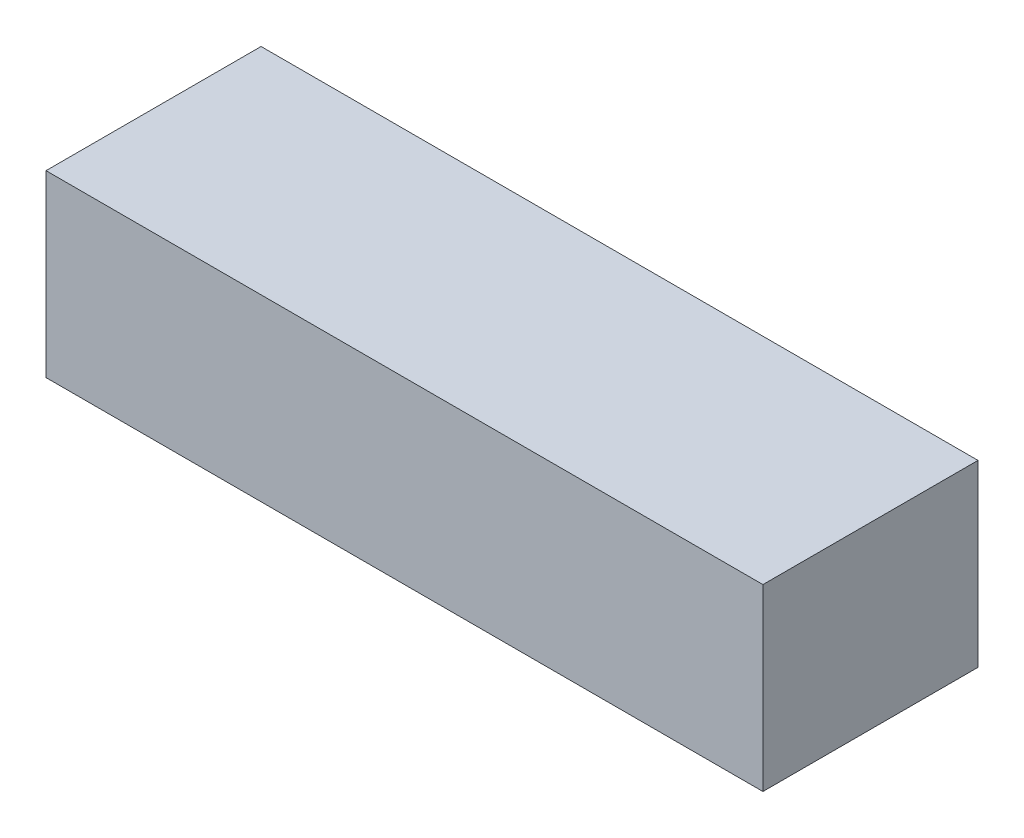
ISO-10303-21;
HEADER;
FILE_DESCRIPTION(('STEP AP214'),'2;1');
FILE_NAME('part.step','',(''),(''),'','','');
FILE_SCHEMA(('AUTOMOTIVE_DESIGN { 1 0 10303 214 1 1 1 1 }'));
ENDSEC;
DATA;
#1=APPLICATION_CONTEXT('core data for automotive mechanical design processes');
#2=APPLICATION_PROTOCOL_DEFINITION('international standard','automotive_design',2000,#1);
#3=PRODUCT_CONTEXT('',#1,'mechanical');
#4=PRODUCT('Part','Part','',(#3));
#5=PRODUCT_RELATED_PRODUCT_CATEGORY('part','',(#4));
#6=PRODUCT_DEFINITION_FORMATION('','',#4);
#7=PRODUCT_DEFINITION_CONTEXT('part definition',#1,'design');
#8=PRODUCT_DEFINITION('design','',#6,#7);
#9=PRODUCT_DEFINITION_SHAPE('','',#8);
#10=(LENGTH_UNIT() NAMED_UNIT(*) SI_UNIT(.MILLI.,.METRE.));
#11=(NAMED_UNIT(*) PLANE_ANGLE_UNIT() SI_UNIT($,.RADIAN.));
#12=(NAMED_UNIT(*) SI_UNIT($,.STERADIAN.) SOLID_ANGLE_UNIT());
#13=UNCERTAINTY_MEASURE_WITH_UNIT(LENGTH_MEASURE(1.E-05),#10,'distance_accuracy_value','');
#14=(GEOMETRIC_REPRESENTATION_CONTEXT(3) GLOBAL_UNCERTAINTY_ASSIGNED_CONTEXT((#13)) GLOBAL_UNIT_ASSIGNED_CONTEXT((#10,
#11,#12)) REPRESENTATION_CONTEXT('',''));
#15=CARTESIAN_POINT('',(0.,0.,0.));
#16=DIRECTION('',(0.,0.,1.));
#17=DIRECTION('',(1.,0.,0.));
#18=AXIS2_PLACEMENT_3D('',#15,#16,#17);
#19=CARTESIAN_POINT('',(7.77445109122676,5.,-6.));
#20=DIRECTION('',(1.,0.,0.));
#21=DIRECTION('',(0.,0.,-1.));
#22=AXIS2_PLACEMENT_3D('',#19,#20,#21);
#23=PLANE('',#22);
#24=DIRECTION('',(0.,0.,1.));
#25=VECTOR('',#24,1.);
#26=CARTESIAN_POINT('',(7.77445109122676,0.,-6.));
#27=LINE('',#26,#25);
#28=CARTESIAN_POINT('',(7.77445109122676,0.,-6.));
#29=VERTEX_POINT('',#28);
#30=CARTESIAN_POINT('',(7.77445109122676,0.,0.));
#31=VERTEX_POINT('',#30);
#32=EDGE_CURVE('E98',#29,#31,#27,.T.);
#33=ORIENTED_EDGE('',*,*,#32,.T.);
#34=DIRECTION('',(0.,-1.,0.));
#35=VECTOR('',#34,1.);
#36=CARTESIAN_POINT('',(7.77445109122676,5.,0.));
#37=LINE('',#36,#35);
#38=CARTESIAN_POINT('',(7.77445109122676,5.,0.));
#39=VERTEX_POINT('',#38);
#40=EDGE_CURVE('E11',#39,#31,#37,.T.);
#41=ORIENTED_EDGE('',*,*,#40,.F.);
#42=DIRECTION('',(0.,0.,1.));
#43=VECTOR('',#42,1.);
#44=CARTESIAN_POINT('',(7.77445109122676,5.,-6.));
#45=LINE('',#44,#43);
#46=CARTESIAN_POINT('',(7.77445109122676,5.,-6.));
#47=VERTEX_POINT('',#46);
#48=EDGE_CURVE('E86',#47,#39,#45,.T.);
#49=ORIENTED_EDGE('',*,*,#48,.F.);
#50=DIRECTION('',(0.,-1.,0.));
#51=VECTOR('',#50,1.);
#52=CARTESIAN_POINT('',(7.77445109122676,5.,-6.));
#53=LINE('',#52,#51);
#54=EDGE_CURVE('E94',#47,#29,#53,.T.);
#55=ORIENTED_EDGE('',*,*,#54,.T.);
#56=EDGE_LOOP('',(#33,#41,#49,#55));
#57=FACE_BOUND('',#56,.T.);
#58=ADVANCED_FACE('F35',(#57),#23,.F.);
#59=CARTESIAN_POINT('',(7.77445109122676,5.,0.));
#60=DIRECTION('',(0.,0.,-1.));
#61=DIRECTION('',(-1.,0.,0.));
#62=AXIS2_PLACEMENT_3D('',#59,#60,#61);
#63=PLANE('',#62);
#64=DIRECTION('',(1.,0.,0.));
#65=VECTOR('',#64,1.);
#66=CARTESIAN_POINT('',(7.77445109122676,0.,0.));
#67=LINE('',#66,#65);
#68=CARTESIAN_POINT('',(27.7744510912268,0.,0.));
#69=VERTEX_POINT('',#68);
#70=EDGE_CURVE('E90',#31,#69,#67,.T.);
#71=ORIENTED_EDGE('',*,*,#70,.T.);
#72=DIRECTION('',(0.,-1.,0.));
#73=VECTOR('',#72,1.);
#74=CARTESIAN_POINT('',(27.7744510912268,5.,0.));
#75=LINE('',#74,#73);
#76=CARTESIAN_POINT('',(27.7744510912268,5.,0.));
#77=VERTEX_POINT('',#76);
#78=EDGE_CURVE('E43',#77,#69,#75,.T.);
#79=ORIENTED_EDGE('',*,*,#78,.F.);
#80=DIRECTION('',(1.,0.,0.));
#81=VECTOR('',#80,1.);
#82=CARTESIAN_POINT('',(7.77445109122676,5.,0.));
#83=LINE('',#82,#81);
#84=EDGE_CURVE('E81',#39,#77,#83,.T.);
#85=ORIENTED_EDGE('',*,*,#84,.F.);
#86=ORIENTED_EDGE('',*,*,#40,.T.);
#87=EDGE_LOOP('',(#71,#79,#85,#86));
#88=FACE_BOUND('',#87,.T.);
#89=ADVANCED_FACE('F89',(#88),#63,.F.);
#90=CARTESIAN_POINT('',(27.7744510912268,5.,0.));
#91=DIRECTION('',(-1.,0.,0.));
#92=DIRECTION('',(0.,0.,1.));
#93=AXIS2_PLACEMENT_3D('',#90,#91,#92);
#94=PLANE('',#93);
#95=DIRECTION('',(0.,0.,-1.));
#96=VECTOR('',#95,1.);
#97=CARTESIAN_POINT('',(27.7744510912268,0.,0.));
#98=LINE('',#97,#96);
#99=CARTESIAN_POINT('',(27.7744510912268,0.,-6.));
#100=VERTEX_POINT('',#99);
#101=EDGE_CURVE('E68',#69,#100,#98,.T.);
#102=ORIENTED_EDGE('',*,*,#101,.T.);
#103=DIRECTION('',(0.,-1.,0.));
#104=VECTOR('',#103,1.);
#105=CARTESIAN_POINT('',(27.7744510912268,5.,-6.));
#106=LINE('',#105,#104);
#107=CARTESIAN_POINT('',(27.7744510912268,5.,-6.));
#108=VERTEX_POINT('',#107);
#109=EDGE_CURVE('E91',#108,#100,#106,.T.);
#110=ORIENTED_EDGE('',*,*,#109,.F.);
#111=DIRECTION('',(0.,0.,-1.));
#112=VECTOR('',#111,1.);
#113=CARTESIAN_POINT('',(27.7744510912268,5.,0.));
#114=LINE('',#113,#112);
#115=EDGE_CURVE('E84',#77,#108,#114,.T.);
#116=ORIENTED_EDGE('',*,*,#115,.F.);
#117=ORIENTED_EDGE('',*,*,#78,.T.);
#118=EDGE_LOOP('',(#102,#110,#116,#117));
#119=FACE_BOUND('',#118,.T.);
#120=ADVANCED_FACE('F92',(#119),#94,.F.);
#121=CARTESIAN_POINT('',(27.7744510912268,5.,-6.));
#122=DIRECTION('',(0.,0.,1.));
#123=DIRECTION('',(1.,0.,0.));
#124=AXIS2_PLACEMENT_3D('',#121,#122,#123);
#125=PLANE('',#124);
#126=DIRECTION('',(-1.,0.,0.));
#127=VECTOR('',#126,1.);
#128=CARTESIAN_POINT('',(27.7744510912268,0.,-6.));
#129=LINE('',#128,#127);
#130=EDGE_CURVE('E74',#100,#29,#129,.T.);
#131=ORIENTED_EDGE('',*,*,#130,.T.);
#132=ORIENTED_EDGE('',*,*,#54,.F.);
#133=DIRECTION('',(-1.,0.,0.));
#134=VECTOR('',#133,1.);
#135=CARTESIAN_POINT('',(27.7744510912268,5.,-6.));
#136=LINE('',#135,#134);
#137=EDGE_CURVE('E51',#108,#47,#136,.T.);
#138=ORIENTED_EDGE('',*,*,#137,.F.);
#139=ORIENTED_EDGE('',*,*,#109,.T.);
#140=EDGE_LOOP('',(#131,#132,#138,#139));
#141=FACE_BOUND('',#140,.T.);
#142=ADVANCED_FACE('F105',(#141),#125,.F.);
#143=CARTESIAN_POINT('',(0.,5.,0.));
#144=DIRECTION('',(0.,1.,0.));
#145=DIRECTION('',(0.,0.,1.));
#146=AXIS2_PLACEMENT_3D('',#143,#144,#145);
#147=PLANE('',#146);
#148=ORIENTED_EDGE('',*,*,#48,.T.);
#149=ORIENTED_EDGE('',*,*,#84,.T.);
#150=ORIENTED_EDGE('',*,*,#115,.T.);
#151=ORIENTED_EDGE('',*,*,#137,.T.);
#152=EDGE_LOOP('',(#148,#149,#150,#151));
#153=FACE_BOUND('',#152,.T.);
#154=ADVANCED_FACE('F82',(#153),#147,.T.);
#155=CARTESIAN_POINT('',(0.,0.,0.));
#156=DIRECTION('',(0.,1.,0.));
#157=DIRECTION('',(0.,0.,1.));
#158=AXIS2_PLACEMENT_3D('',#155,#156,#157);
#159=PLANE('',#158);
#160=ORIENTED_EDGE('',*,*,#32,.F.);
#161=ORIENTED_EDGE('',*,*,#130,.F.);
#162=ORIENTED_EDGE('',*,*,#101,.F.);
#163=ORIENTED_EDGE('',*,*,#70,.F.);
#164=EDGE_LOOP('',(#160,#161,#162,#163));
#165=FACE_BOUND('',#164,.T.);
#166=ADVANCED_FACE('F108',(#165),#159,.F.);
#167=CLOSED_SHELL('',(#58,#89,#120,#142,#154,#166));
#168=MANIFOLD_SOLID_BREP('B2',#167);
#169=ADVANCED_BREP_SHAPE_REPRESENTATION('',(#18,#168),#14);
#170=SHAPE_DEFINITION_REPRESENTATION(#9,#169);
ENDSEC;
END-ISO-10303-21;
